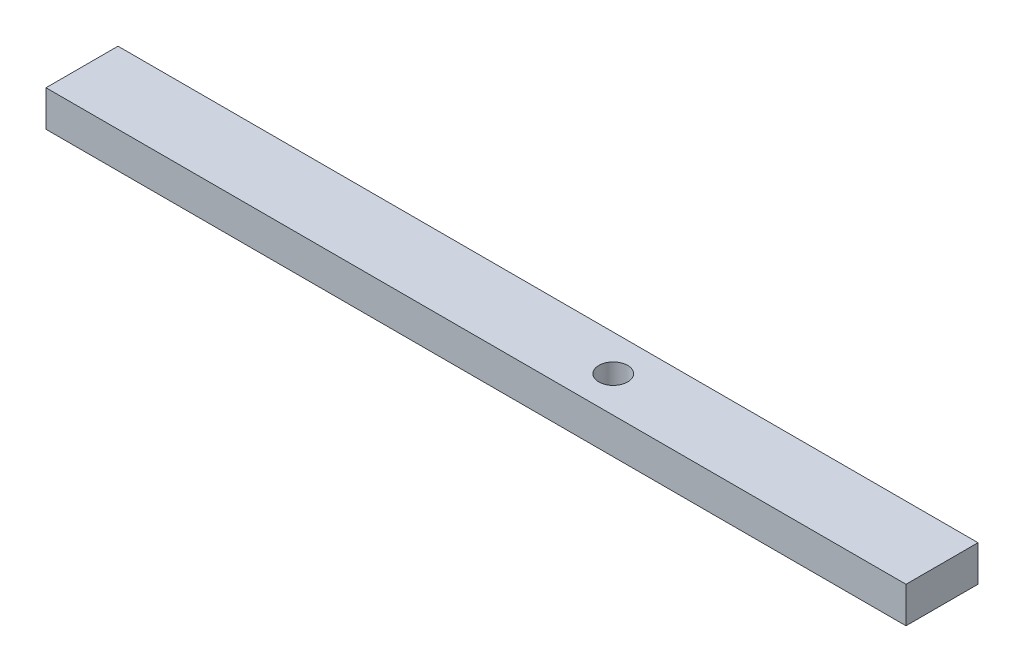
ISO-10303-21;
HEADER;
FILE_DESCRIPTION(('STEP AP214'),'2;1');
FILE_NAME('part.step','',(''),(''),'','','');
FILE_SCHEMA(('AUTOMOTIVE_DESIGN { 1 0 10303 214 1 1 1 1 }'));
ENDSEC;
DATA;
#1=APPLICATION_CONTEXT('core data for automotive mechanical design processes');
#2=APPLICATION_PROTOCOL_DEFINITION('international standard','automotive_design',2000,#1);
#3=PRODUCT_CONTEXT('',#1,'mechanical');
#4=PRODUCT('Part','Part','',(#3));
#5=PRODUCT_RELATED_PRODUCT_CATEGORY('part','',(#4));
#6=PRODUCT_DEFINITION_FORMATION('','',#4);
#7=PRODUCT_DEFINITION_CONTEXT('part definition',#1,'design');
#8=PRODUCT_DEFINITION('design','',#6,#7);
#9=PRODUCT_DEFINITION_SHAPE('','',#8);
#10=(LENGTH_UNIT() NAMED_UNIT(*) SI_UNIT(.MILLI.,.METRE.));
#11=(NAMED_UNIT(*) PLANE_ANGLE_UNIT() SI_UNIT($,.RADIAN.));
#12=(NAMED_UNIT(*) SI_UNIT($,.STERADIAN.) SOLID_ANGLE_UNIT());
#13=UNCERTAINTY_MEASURE_WITH_UNIT(LENGTH_MEASURE(1.E-05),#10,'distance_accuracy_value','');
#14=(GEOMETRIC_REPRESENTATION_CONTEXT(3) GLOBAL_UNCERTAINTY_ASSIGNED_CONTEXT((#13)) GLOBAL_UNIT_ASSIGNED_CONTEXT((#10,
#11,#12)) REPRESENTATION_CONTEXT('',''));
#15=CARTESIAN_POINT('',(0.,0.,0.));
#16=DIRECTION('',(0.,0.,1.));
#17=DIRECTION('',(1.,0.,0.));
#18=AXIS2_PLACEMENT_3D('',#15,#16,#17);
#19=CARTESIAN_POINT('',(0.,5.,0.));
#20=DIRECTION('',(0.,1.,0.));
#21=DIRECTION('',(0.,0.,1.));
#22=AXIS2_PLACEMENT_3D('',#19,#20,#21);
#23=PLANE('',#22);
#24=DIRECTION('',(0.,0.,-1.));
#25=VECTOR('',#24,1.);
#26=CARTESIAN_POINT('',(0.,5.,-10.));
#27=LINE('',#26,#25);
#28=CARTESIAN_POINT('',(0.,5.,0.));
#29=VERTEX_POINT('',#28);
#30=CARTESIAN_POINT('',(0.,5.,-10.));
#31=VERTEX_POINT('',#30);
#32=EDGE_CURVE('E85',#29,#31,#27,.T.);
#33=ORIENTED_EDGE('',*,*,#32,.T.);
#34=DIRECTION('',(-1.,0.,0.));
#35=VECTOR('',#34,1.);
#36=CARTESIAN_POINT('',(-119.448982354137,5.,-10.));
#37=LINE('',#36,#35);
#38=CARTESIAN_POINT('',(-119.448982354137,5.,-10.));
#39=VERTEX_POINT('',#38);
#40=EDGE_CURVE('E80',#31,#39,#37,.T.);
#41=ORIENTED_EDGE('',*,*,#40,.T.);
#42=DIRECTION('',(0.,0.,1.));
#43=VECTOR('',#42,1.);
#44=CARTESIAN_POINT('',(-119.448982354137,5.,-10.));
#45=LINE('',#44,#43);
#46=CARTESIAN_POINT('',(-119.448982354137,5.,0.));
#47=VERTEX_POINT('',#46);
#48=EDGE_CURVE('E83',#39,#47,#45,.T.);
#49=ORIENTED_EDGE('',*,*,#48,.T.);
#50=DIRECTION('',(1.,0.,0.));
#51=VECTOR('',#50,1.);
#52=CARTESIAN_POINT('',(-119.448982354137,5.,0.));
#53=LINE('',#52,#51);
#54=EDGE_CURVE('E50',#47,#29,#53,.T.);
#55=ORIENTED_EDGE('',*,*,#54,.T.);
#56=EDGE_LOOP('',(#33,#41,#49,#55));
#57=FACE_BOUND('',#56,.T.);
#58=CARTESIAN_POINT('',(-45.6614123252137,5.,-5.));
#59=DIRECTION('',(0.,1.,0.));
#60=DIRECTION('',(0.,0.,1.));
#61=AXIS2_PLACEMENT_3D('',#58,#59,#60);
#62=CIRCLE('',#61,2.);
#63=CARTESIAN_POINT('',(-45.6614123252137,5.,-3.));
#64=VERTEX_POINT('',#63);
#65=EDGE_CURVE('E100',#64,#64,#62,.T.);
#66=ORIENTED_EDGE('',*,*,#65,.F.);
#67=EDGE_LOOP('',(#66));
#68=FACE_BOUND('',#67,.T.);
#69=ADVANCED_FACE('F33',(#57,#68),#23,.T.);
#70=CARTESIAN_POINT('',(0.,0.,0.));
#71=DIRECTION('',(0.,1.,0.));
#72=DIRECTION('',(0.,0.,1.));
#73=AXIS2_PLACEMENT_3D('',#70,#71,#72);
#74=PLANE('',#73);
#75=DIRECTION('',(0.,0.,-1.));
#76=VECTOR('',#75,1.);
#77=CARTESIAN_POINT('',(0.,0.,-10.));
#78=LINE('',#77,#76);
#79=CARTESIAN_POINT('',(0.,0.,0.));
#80=VERTEX_POINT('',#79);
#81=CARTESIAN_POINT('',(0.,0.,-10.));
#82=VERTEX_POINT('',#81);
#83=EDGE_CURVE('E97',#80,#82,#78,.T.);
#84=ORIENTED_EDGE('',*,*,#83,.F.);
#85=DIRECTION('',(1.,0.,0.));
#86=VECTOR('',#85,1.);
#87=CARTESIAN_POINT('',(-119.448982354137,0.,0.));
#88=LINE('',#87,#86);
#89=CARTESIAN_POINT('',(-119.448982354137,0.,0.));
#90=VERTEX_POINT('',#89);
#91=EDGE_CURVE('E73',#90,#80,#88,.T.);
#92=ORIENTED_EDGE('',*,*,#91,.F.);
#93=DIRECTION('',(0.,0.,1.));
#94=VECTOR('',#93,1.);
#95=CARTESIAN_POINT('',(-119.448982354137,0.,-10.));
#96=LINE('',#95,#94);
#97=CARTESIAN_POINT('',(-119.448982354137,0.,-10.));
#98=VERTEX_POINT('',#97);
#99=EDGE_CURVE('E67',#98,#90,#96,.T.);
#100=ORIENTED_EDGE('',*,*,#99,.F.);
#101=DIRECTION('',(-1.,0.,0.));
#102=VECTOR('',#101,1.);
#103=CARTESIAN_POINT('',(-119.448982354137,0.,-10.));
#104=LINE('',#103,#102);
#105=EDGE_CURVE('E89',#82,#98,#104,.T.);
#106=ORIENTED_EDGE('',*,*,#105,.F.);
#107=EDGE_LOOP('',(#84,#92,#100,#106));
#108=FACE_BOUND('',#107,.T.);
#109=CARTESIAN_POINT('',(-45.6614123252137,0.,-5.));
#110=DIRECTION('',(0.,1.,0.));
#111=DIRECTION('',(0.,0.,1.));
#112=AXIS2_PLACEMENT_3D('',#109,#110,#111);
#113=CIRCLE('',#112,2.);
#114=CARTESIAN_POINT('',(-45.6614123252137,0.,-3.));
#115=VERTEX_POINT('',#114);
#116=EDGE_CURVE('E112',#115,#115,#113,.T.);
#117=ORIENTED_EDGE('',*,*,#116,.T.);
#118=EDGE_LOOP('',(#117));
#119=FACE_BOUND('',#118,.T.);
#120=ADVANCED_FACE('F108',(#108,#119),#74,.F.);
#121=CARTESIAN_POINT('',(0.,5.,-10.));
#122=DIRECTION('',(-1.,0.,0.));
#123=DIRECTION('',(0.,0.,1.));
#124=AXIS2_PLACEMENT_3D('',#121,#122,#123);
#125=PLANE('',#124);
#126=ORIENTED_EDGE('',*,*,#83,.T.);
#127=DIRECTION('',(0.,-1.,0.));
#128=VECTOR('',#127,1.);
#129=CARTESIAN_POINT('',(0.,5.,-10.));
#130=LINE('',#129,#128);
#131=EDGE_CURVE('E11',#31,#82,#130,.T.);
#132=ORIENTED_EDGE('',*,*,#131,.F.);
#133=ORIENTED_EDGE('',*,*,#32,.F.);
#134=DIRECTION('',(0.,-1.,0.));
#135=VECTOR('',#134,1.);
#136=CARTESIAN_POINT('',(0.,5.,0.));
#137=LINE('',#136,#135);
#138=EDGE_CURVE('E93',#29,#80,#137,.T.);
#139=ORIENTED_EDGE('',*,*,#138,.T.);
#140=EDGE_LOOP('',(#126,#132,#133,#139));
#141=FACE_BOUND('',#140,.T.);
#142=ADVANCED_FACE('F35',(#141),#125,.F.);
#143=CARTESIAN_POINT('',(-119.448982354137,5.,-10.));
#144=DIRECTION('',(0.,0.,1.));
#145=DIRECTION('',(1.,0.,0.));
#146=AXIS2_PLACEMENT_3D('',#143,#144,#145);
#147=PLANE('',#146);
#148=ORIENTED_EDGE('',*,*,#105,.T.);
#149=DIRECTION('',(0.,-1.,0.));
#150=VECTOR('',#149,1.);
#151=CARTESIAN_POINT('',(-119.448982354137,5.,-10.));
#152=LINE('',#151,#150);
#153=EDGE_CURVE('E42',#39,#98,#152,.T.);
#154=ORIENTED_EDGE('',*,*,#153,.F.);
#155=ORIENTED_EDGE('',*,*,#40,.F.);
#156=ORIENTED_EDGE('',*,*,#131,.T.);
#157=EDGE_LOOP('',(#148,#154,#155,#156));
#158=FACE_BOUND('',#157,.T.);
#159=ADVANCED_FACE('F88',(#158),#147,.F.);
#160=CARTESIAN_POINT('',(-119.448982354137,5.,-10.));
#161=DIRECTION('',(1.,0.,0.));
#162=DIRECTION('',(0.,0.,-1.));
#163=AXIS2_PLACEMENT_3D('',#160,#161,#162);
#164=PLANE('',#163);
#165=ORIENTED_EDGE('',*,*,#99,.T.);
#166=DIRECTION('',(0.,-1.,0.));
#167=VECTOR('',#166,1.);
#168=CARTESIAN_POINT('',(-119.448982354137,5.,0.));
#169=LINE('',#168,#167);
#170=EDGE_CURVE('E90',#47,#90,#169,.T.);
#171=ORIENTED_EDGE('',*,*,#170,.F.);
#172=ORIENTED_EDGE('',*,*,#48,.F.);
#173=ORIENTED_EDGE('',*,*,#153,.T.);
#174=EDGE_LOOP('',(#165,#171,#172,#173));
#175=FACE_BOUND('',#174,.T.);
#176=ADVANCED_FACE('F91',(#175),#164,.F.);
#177=CARTESIAN_POINT('',(-119.448982354137,5.,0.));
#178=DIRECTION('',(0.,0.,-1.));
#179=DIRECTION('',(-1.,0.,0.));
#180=AXIS2_PLACEMENT_3D('',#177,#178,#179);
#181=PLANE('',#180);
#182=ORIENTED_EDGE('',*,*,#91,.T.);
#183=ORIENTED_EDGE('',*,*,#138,.F.);
#184=ORIENTED_EDGE('',*,*,#54,.F.);
#185=ORIENTED_EDGE('',*,*,#170,.T.);
#186=EDGE_LOOP('',(#182,#183,#184,#185));
#187=FACE_BOUND('',#186,.T.);
#188=ADVANCED_FACE('F105',(#187),#181,.F.);
#189=CARTESIAN_POINT('',(-45.6614123252137,5.,-5.));
#190=DIRECTION('',(0.,-1.,0.));
#191=DIRECTION('',(0.,0.,-1.));
#192=AXIS2_PLACEMENT_3D('',#189,#190,#191);
#193=CYLINDRICAL_SURFACE('',#192,2.);
#194=ORIENTED_EDGE('',*,*,#65,.T.);
#195=EDGE_LOOP('',(#194));
#196=FACE_BOUND('',#195,.T.);
#197=ORIENTED_EDGE('',*,*,#116,.F.);
#198=EDGE_LOOP('',(#197));
#199=FACE_BOUND('',#198,.T.);
#200=ADVANCED_FACE('F118',(#196,#199),#193,.F.);
#201=CLOSED_SHELL('',(#69,#120,#142,#159,#176,#188,#200));
#202=MANIFOLD_SOLID_BREP('B2',#201);
#203=ADVANCED_BREP_SHAPE_REPRESENTATION('',(#18,#202),#14);
#204=SHAPE_DEFINITION_REPRESENTATION(#9,#203);
ENDSEC;
END-ISO-10303-21;
